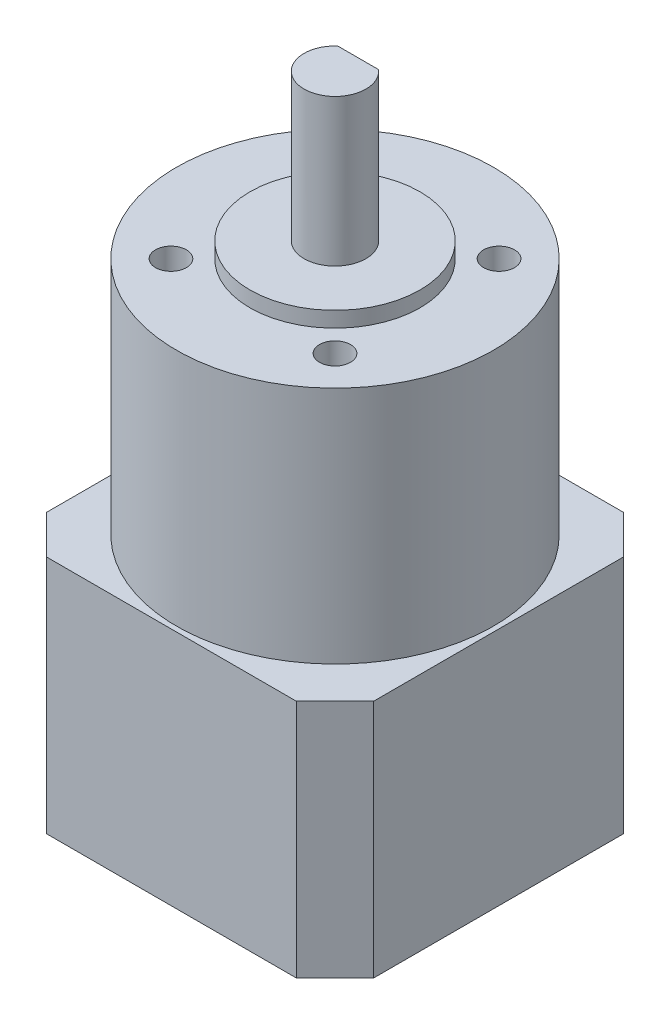
ISO-10303-21;
HEADER;
FILE_DESCRIPTION(('STEP AP214'),'2;1');
FILE_NAME('part.step','',(''),(''),'','','');
FILE_SCHEMA(('AUTOMOTIVE_DESIGN { 1 0 10303 214 1 1 1 1 }'));
ENDSEC;
DATA;
#1=APPLICATION_CONTEXT('core data for automotive mechanical design processes');
#2=APPLICATION_PROTOCOL_DEFINITION('international standard','automotive_design',2000,#1);
#3=PRODUCT_CONTEXT('',#1,'mechanical');
#4=PRODUCT('Part','Part','',(#3));
#5=PRODUCT_RELATED_PRODUCT_CATEGORY('part','',(#4));
#6=PRODUCT_DEFINITION_FORMATION('','',#4);
#7=PRODUCT_DEFINITION_CONTEXT('part definition',#1,'design');
#8=PRODUCT_DEFINITION('design','',#6,#7);
#9=PRODUCT_DEFINITION_SHAPE('','',#8);
#10=(LENGTH_UNIT() NAMED_UNIT(*) SI_UNIT(.MILLI.,.METRE.));
#11=(NAMED_UNIT(*) PLANE_ANGLE_UNIT() SI_UNIT($,.RADIAN.));
#12=(NAMED_UNIT(*) SI_UNIT($,.STERADIAN.) SOLID_ANGLE_UNIT());
#13=UNCERTAINTY_MEASURE_WITH_UNIT(LENGTH_MEASURE(1.E-05),#10,'distance_accuracy_value','');
#14=(GEOMETRIC_REPRESENTATION_CONTEXT(3) GLOBAL_UNCERTAINTY_ASSIGNED_CONTEXT((#13)) GLOBAL_UNIT_ASSIGNED_CONTEXT((#10,
#11,#12)) REPRESENTATION_CONTEXT('',''));
#15=CARTESIAN_POINT('',(0.,0.,0.));
#16=DIRECTION('',(0.,0.,1.));
#17=DIRECTION('',(1.,0.,0.));
#18=AXIS2_PLACEMENT_3D('',#15,#16,#17);
#19=CARTESIAN_POINT('',(-21.15,-30.9,-21.15));
#20=DIRECTION('',(0.,0.,-1.));
#21=DIRECTION('',(-1.,0.,0.));
#22=AXIS2_PLACEMENT_3D('',#19,#20,#21);
#23=PLANE('',#22);
#24=DIRECTION('',(1.,0.,0.));
#25=VECTOR('',#24,1.);
#26=CARTESIAN_POINT('',(-21.15,-61.9,-21.15));
#27=LINE('',#26,#25);
#28=CARTESIAN_POINT('',(-16.15,-61.9,-21.15));
#29=VERTEX_POINT('',#28);
#30=CARTESIAN_POINT('',(16.1500000000001,-61.9,-21.15));
#31=VERTEX_POINT('',#30);
#32=EDGE_CURVE('E156',#29,#31,#27,.T.);
#33=ORIENTED_EDGE('',*,*,#32,.F.);
#34=DIRECTION('',(0.,1.,0.));
#35=VECTOR('',#34,1.);
#36=CARTESIAN_POINT('',(-16.15,-30.9,-21.15));
#37=LINE('',#36,#35);
#38=CARTESIAN_POINT('',(-16.15,-30.9,-21.15));
#39=VERTEX_POINT('',#38);
#40=EDGE_CURVE('E11',#29,#39,#37,.T.);
#41=ORIENTED_EDGE('',*,*,#40,.T.);
#42=DIRECTION('',(1.,0.,0.));
#43=VECTOR('',#42,1.);
#44=CARTESIAN_POINT('',(-21.15,-30.9,-21.15));
#45=LINE('',#44,#43);
#46=CARTESIAN_POINT('',(16.1500000000001,-30.9,-21.15));
#47=VERTEX_POINT('',#46);
#48=EDGE_CURVE('E160',#39,#47,#45,.T.);
#49=ORIENTED_EDGE('',*,*,#48,.T.);
#50=DIRECTION('',(0.,-1.,0.));
#51=VECTOR('',#50,1.);
#52=CARTESIAN_POINT('',(16.1500000000001,-30.9,-21.15));
#53=LINE('',#52,#51);
#54=EDGE_CURVE('E47',#47,#31,#53,.T.);
#55=ORIENTED_EDGE('',*,*,#54,.T.);
#56=EDGE_LOOP('',(#33,#41,#49,#55));
#57=FACE_BOUND('',#56,.T.);
#58=ADVANCED_FACE('F38',(#57),#23,.T.);
#59=CARTESIAN_POINT('',(-21.15,-30.9,21.15));
#60=DIRECTION('',(-1.,0.,0.));
#61=DIRECTION('',(0.,0.,1.));
#62=AXIS2_PLACEMENT_3D('',#59,#60,#61);
#63=PLANE('',#62);
#64=DIRECTION('',(0.,0.,-1.));
#65=VECTOR('',#64,1.);
#66=CARTESIAN_POINT('',(-21.15,-61.9,21.15));
#67=LINE('',#66,#65);
#68=CARTESIAN_POINT('',(-21.15,-61.9,16.15));
#69=VERTEX_POINT('',#68);
#70=CARTESIAN_POINT('',(-21.15,-61.9,-16.1500000000001));
#71=VERTEX_POINT('',#70);
#72=EDGE_CURVE('E164',#69,#71,#67,.T.);
#73=ORIENTED_EDGE('',*,*,#72,.F.);
#74=DIRECTION('',(0.,1.,0.));
#75=VECTOR('',#74,1.);
#76=CARTESIAN_POINT('',(-21.15,-30.9,16.15));
#77=LINE('',#76,#75);
#78=CARTESIAN_POINT('',(-21.15,-30.9,16.15));
#79=VERTEX_POINT('',#78);
#80=EDGE_CURVE('E196',#69,#79,#77,.T.);
#81=ORIENTED_EDGE('',*,*,#80,.T.);
#82=DIRECTION('',(0.,0.,-1.));
#83=VECTOR('',#82,1.);
#84=CARTESIAN_POINT('',(-21.15,-30.9,21.15));
#85=LINE('',#84,#83);
#86=CARTESIAN_POINT('',(-21.15,-30.9,-16.1500000000001));
#87=VERTEX_POINT('',#86);
#88=EDGE_CURVE('E159',#79,#87,#85,.T.);
#89=ORIENTED_EDGE('',*,*,#88,.T.);
#90=DIRECTION('',(0.,-1.,0.));
#91=VECTOR('',#90,1.);
#92=CARTESIAN_POINT('',(-21.15,-30.9,-16.1500000000001));
#93=LINE('',#92,#91);
#94=EDGE_CURVE('E193',#87,#71,#93,.T.);
#95=ORIENTED_EDGE('',*,*,#94,.T.);
#96=EDGE_LOOP('',(#73,#81,#89,#95));
#97=FACE_BOUND('',#96,.T.);
#98=ADVANCED_FACE('F224',(#97),#63,.T.);
#99=CARTESIAN_POINT('',(21.15,-30.9,21.15));
#100=DIRECTION('',(0.,0.,1.));
#101=DIRECTION('',(1.,0.,0.));
#102=AXIS2_PLACEMENT_3D('',#99,#100,#101);
#103=PLANE('',#102);
#104=DIRECTION('',(-1.,0.,0.));
#105=VECTOR('',#104,1.);
#106=CARTESIAN_POINT('',(21.15,-30.9,21.15));
#107=LINE('',#106,#105);
#108=CARTESIAN_POINT('',(16.15,-30.9,21.15));
#109=VERTEX_POINT('',#108);
#110=CARTESIAN_POINT('',(-16.1500000000001,-30.9,21.15));
#111=VERTEX_POINT('',#110);
#112=EDGE_CURVE('E166',#109,#111,#107,.T.);
#113=ORIENTED_EDGE('',*,*,#112,.T.);
#114=DIRECTION('',(0.,-1.,0.));
#115=VECTOR('',#114,1.);
#116=CARTESIAN_POINT('',(-16.1500000000001,-30.9,21.15));
#117=LINE('',#116,#115);
#118=CARTESIAN_POINT('',(-16.1500000000001,-61.9,21.15));
#119=VERTEX_POINT('',#118);
#120=EDGE_CURVE('E182',#111,#119,#117,.T.);
#121=ORIENTED_EDGE('',*,*,#120,.T.);
#122=DIRECTION('',(-1.,0.,0.));
#123=VECTOR('',#122,1.);
#124=CARTESIAN_POINT('',(21.15,-61.9,21.15));
#125=LINE('',#124,#123);
#126=CARTESIAN_POINT('',(16.15,-61.9,21.15));
#127=VERTEX_POINT('',#126);
#128=EDGE_CURVE('E176',#127,#119,#125,.T.);
#129=ORIENTED_EDGE('',*,*,#128,.F.);
#130=DIRECTION('',(0.,1.,0.));
#131=VECTOR('',#130,1.);
#132=CARTESIAN_POINT('',(16.15,-30.9,21.15));
#133=LINE('',#132,#131);
#134=EDGE_CURVE('E146',#127,#109,#133,.T.);
#135=ORIENTED_EDGE('',*,*,#134,.T.);
#136=EDGE_LOOP('',(#113,#121,#129,#135));
#137=FACE_BOUND('',#136,.T.);
#138=ADVANCED_FACE('F234',(#137),#103,.T.);
#139=CARTESIAN_POINT('',(21.15,-30.9,-21.15));
#140=DIRECTION('',(1.,0.,0.));
#141=DIRECTION('',(0.,0.,-1.));
#142=AXIS2_PLACEMENT_3D('',#139,#140,#141);
#143=PLANE('',#142);
#144=DIRECTION('',(0.,0.,1.));
#145=VECTOR('',#144,1.);
#146=CARTESIAN_POINT('',(21.15,-30.9,-21.15));
#147=LINE('',#146,#145);
#148=CARTESIAN_POINT('',(21.15,-30.9,-16.15));
#149=VERTEX_POINT('',#148);
#150=CARTESIAN_POINT('',(21.15,-30.9,16.1500000000001));
#151=VERTEX_POINT('',#150);
#152=EDGE_CURVE('E163',#149,#151,#147,.T.);
#153=ORIENTED_EDGE('',*,*,#152,.T.);
#154=DIRECTION('',(0.,-1.,0.));
#155=VECTOR('',#154,1.);
#156=CARTESIAN_POINT('',(21.15,-30.9,16.1500000000001));
#157=LINE('',#156,#155);
#158=CARTESIAN_POINT('',(21.15,-61.9,16.1500000000001));
#159=VERTEX_POINT('',#158);
#160=EDGE_CURVE('E206',#151,#159,#157,.T.);
#161=ORIENTED_EDGE('',*,*,#160,.T.);
#162=DIRECTION('',(0.,0.,1.));
#163=VECTOR('',#162,1.);
#164=CARTESIAN_POINT('',(21.15,-61.9,-21.15));
#165=LINE('',#164,#163);
#166=CARTESIAN_POINT('',(21.15,-61.9,-16.15));
#167=VERTEX_POINT('',#166);
#168=EDGE_CURVE('E173',#167,#159,#165,.T.);
#169=ORIENTED_EDGE('',*,*,#168,.F.);
#170=DIRECTION('',(0.,1.,0.));
#171=VECTOR('',#170,1.);
#172=CARTESIAN_POINT('',(21.15,-30.9,-16.15));
#173=LINE('',#172,#171);
#174=EDGE_CURVE('E61',#167,#149,#173,.T.);
#175=ORIENTED_EDGE('',*,*,#174,.T.);
#176=EDGE_LOOP('',(#153,#161,#169,#175));
#177=FACE_BOUND('',#176,.T.);
#178=ADVANCED_FACE('F239',(#177),#143,.T.);
#179=CARTESIAN_POINT('',(0.,-30.9,0.));
#180=DIRECTION('',(0.,-1.,0.));
#181=DIRECTION('',(0.,0.,-1.));
#182=AXIS2_PLACEMENT_3D('',#179,#180,#181);
#183=PLANE('',#182);
#184=CARTESIAN_POINT('',(0.,-30.9,0.));
#185=DIRECTION('',(0.,1.,0.));
#186=DIRECTION('',(0.,0.,1.));
#187=AXIS2_PLACEMENT_3D('',#184,#185,#186);
#188=CIRCLE('',#187,20.5);
#189=CARTESIAN_POINT('',(0.,-30.9,-20.5));
#190=VERTEX_POINT('',#189);
#191=EDGE_CURVE('E153',#190,#190,#188,.T.);
#192=ORIENTED_EDGE('',*,*,#191,.F.);
#193=EDGE_LOOP('',(#192));
#194=FACE_BOUND('',#193,.T.);
#195=ORIENTED_EDGE('',*,*,#88,.F.);
#196=DIRECTION('',(-0.707106781186543,0.,-0.707106781186552));
#197=VECTOR('',#196,1.);
#198=CARTESIAN_POINT('',(-16.1500000000001,-30.9,21.15));
#199=LINE('',#198,#197);
#200=EDGE_CURVE('E203',#79,#111,#199,.F.);
#201=ORIENTED_EDGE('',*,*,#200,.T.);
#202=ORIENTED_EDGE('',*,*,#112,.F.);
#203=DIRECTION('',(-0.707106781186551,0.,0.707106781186544));
#204=VECTOR('',#203,1.);
#205=CARTESIAN_POINT('',(21.15,-30.9,16.1500000000001));
#206=LINE('',#205,#204);
#207=EDGE_CURVE('E54',#109,#151,#206,.F.);
#208=ORIENTED_EDGE('',*,*,#207,.T.);
#209=ORIENTED_EDGE('',*,*,#152,.F.);
#210=DIRECTION('',(0.707106781186543,0.,0.707106781186552));
#211=VECTOR('',#210,1.);
#212=CARTESIAN_POINT('',(16.1500000000001,-30.9,-21.15));
#213=LINE('',#212,#211);
#214=EDGE_CURVE('E198',#149,#47,#213,.F.);
#215=ORIENTED_EDGE('',*,*,#214,.T.);
#216=ORIENTED_EDGE('',*,*,#48,.F.);
#217=DIRECTION('',(0.707106781186551,0.,-0.707106781186544));
#218=VECTOR('',#217,1.);
#219=CARTESIAN_POINT('',(-21.15,-30.9,-16.1500000000001));
#220=LINE('',#219,#218);
#221=EDGE_CURVE('E200',#39,#87,#220,.F.);
#222=ORIENTED_EDGE('',*,*,#221,.T.);
#223=EDGE_LOOP('',(#195,#201,#202,#208,#209,#215,#216,#222));
#224=FACE_BOUND('',#223,.T.);
#225=ADVANCED_FACE('F228',(#194,#224),#183,.F.);
#226=CARTESIAN_POINT('',(0.,-61.9,0.));
#227=DIRECTION('',(0.,-1.,0.));
#228=DIRECTION('',(0.,0.,-1.));
#229=AXIS2_PLACEMENT_3D('',#226,#227,#228);
#230=PLANE('',#229);
#231=ORIENTED_EDGE('',*,*,#128,.T.);
#232=DIRECTION('',(0.707106781186543,0.,0.707106781186552));
#233=VECTOR('',#232,1.);
#234=CARTESIAN_POINT('',(-18.6500000000001,-61.9,18.6499999999999));
#235=LINE('',#234,#233);
#236=EDGE_CURVE('E191',#119,#69,#235,.F.);
#237=ORIENTED_EDGE('',*,*,#236,.T.);
#238=ORIENTED_EDGE('',*,*,#72,.T.);
#239=DIRECTION('',(-0.707106781186551,0.,0.707106781186544));
#240=VECTOR('',#239,1.);
#241=CARTESIAN_POINT('',(-18.6499999999999,-61.9,-18.6500000000001));
#242=LINE('',#241,#240);
#243=EDGE_CURVE('E187',#71,#29,#242,.F.);
#244=ORIENTED_EDGE('',*,*,#243,.T.);
#245=ORIENTED_EDGE('',*,*,#32,.T.);
#246=DIRECTION('',(-0.707106781186543,0.,-0.707106781186552));
#247=VECTOR('',#246,1.);
#248=CARTESIAN_POINT('',(18.6500000000001,-61.9,-18.6499999999999));
#249=LINE('',#248,#247);
#250=EDGE_CURVE('E185',#31,#167,#249,.F.);
#251=ORIENTED_EDGE('',*,*,#250,.T.);
#252=ORIENTED_EDGE('',*,*,#168,.T.);
#253=DIRECTION('',(0.707106781186551,0.,-0.707106781186544));
#254=VECTOR('',#253,1.);
#255=CARTESIAN_POINT('',(18.6499999999999,-61.9,18.6500000000001));
#256=LINE('',#255,#254);
#257=EDGE_CURVE('E189',#159,#127,#256,.F.);
#258=ORIENTED_EDGE('',*,*,#257,.T.);
#259=EDGE_LOOP('',(#231,#237,#238,#244,#245,#251,#252,#258));
#260=FACE_BOUND('',#259,.T.);
#261=ADVANCED_FACE('F217',(#260),#230,.T.);
#262=CARTESIAN_POINT('',(0.,0.,0.));
#263=DIRECTION('',(0.,-1.,0.));
#264=DIRECTION('',(0.,0.,-1.));
#265=AXIS2_PLACEMENT_3D('',#262,#263,#264);
#266=CYLINDRICAL_SURFACE('',#265,20.5);
#267=CARTESIAN_POINT('',(0.,0.,0.));
#268=DIRECTION('',(0.,1.,0.));
#269=DIRECTION('',(0.,0.,1.));
#270=AXIS2_PLACEMENT_3D('',#267,#268,#269);
#271=CIRCLE('',#270,20.5);
#272=CARTESIAN_POINT('',(0.,0.,-20.5));
#273=VERTEX_POINT('',#272);
#274=EDGE_CURVE('E150',#273,#273,#271,.T.);
#275=CARTESIAN_POINT('',(0.,0.,-20.5));
#276=CARTESIAN_POINT('',(0.,-0.321875,-20.5));
#277=CARTESIAN_POINT('',(0.,-0.64375,-20.5));
#278=CARTESIAN_POINT('',(0.,-1.2875,-20.5));
#279=CARTESIAN_POINT('',(0.,-1.609375,-20.5));
#280=CARTESIAN_POINT('',(0.,-2.253125,-20.5));
#281=CARTESIAN_POINT('',(0.,-2.575,-20.5));
#282=CARTESIAN_POINT('',(0.,-3.21875,-20.5));
#283=CARTESIAN_POINT('',(0.,-3.540625,-20.5));
#284=CARTESIAN_POINT('',(0.,-4.184375,-20.5));
#285=CARTESIAN_POINT('',(0.,-4.50625,-20.5));
#286=CARTESIAN_POINT('',(0.,-5.15,-20.5));
#287=CARTESIAN_POINT('',(0.,-5.471875,-20.5));
#288=CARTESIAN_POINT('',(0.,-6.115625,-20.5));
#289=CARTESIAN_POINT('',(0.,-6.4375,-20.5));
#290=CARTESIAN_POINT('',(0.,-7.08125,-20.5));
#291=CARTESIAN_POINT('',(0.,-7.403125,-20.5));
#292=CARTESIAN_POINT('',(0.,-8.046875,-20.5));
#293=CARTESIAN_POINT('',(0.,-8.36875,-20.5));
#294=CARTESIAN_POINT('',(0.,-9.0125,-20.5));
#295=CARTESIAN_POINT('',(0.,-9.334375,-20.5));
#296=CARTESIAN_POINT('',(0.,-9.978125,-20.5));
#297=CARTESIAN_POINT('',(0.,-10.3,-20.5));
#298=CARTESIAN_POINT('',(0.,-10.94375,-20.5));
#299=CARTESIAN_POINT('',(0.,-11.265625,-20.5));
#300=CARTESIAN_POINT('',(0.,-11.909375,-20.5));
#301=CARTESIAN_POINT('',(0.,-12.23125,-20.5));
#302=CARTESIAN_POINT('',(0.,-12.875,-20.5));
#303=CARTESIAN_POINT('',(0.,-13.196875,-20.5));
#304=CARTESIAN_POINT('',(0.,-13.840625,-20.5));
#305=CARTESIAN_POINT('',(0.,-14.1625,-20.5));
#306=CARTESIAN_POINT('',(0.,-14.80625,-20.5));
#307=CARTESIAN_POINT('',(0.,-15.128125,-20.5));
#308=CARTESIAN_POINT('',(0.,-15.771875,-20.5));
#309=CARTESIAN_POINT('',(0.,-16.09375,-20.5));
#310=CARTESIAN_POINT('',(0.,-16.7375,-20.5));
#311=CARTESIAN_POINT('',(0.,-17.059375,-20.5));
#312=CARTESIAN_POINT('',(0.,-17.703125,-20.5));
#313=CARTESIAN_POINT('',(0.,-18.025,-20.5));
#314=CARTESIAN_POINT('',(0.,-18.66875,-20.5));
#315=CARTESIAN_POINT('',(0.,-18.990625,-20.5));
#316=CARTESIAN_POINT('',(0.,-19.634375,-20.5));
#317=CARTESIAN_POINT('',(0.,-19.95625,-20.5));
#318=CARTESIAN_POINT('',(0.,-20.6,-20.5));
#319=CARTESIAN_POINT('',(0.,-20.921875,-20.5));
#320=CARTESIAN_POINT('',(0.,-21.565625,-20.5));
#321=CARTESIAN_POINT('',(0.,-21.8875,-20.5));
#322=CARTESIAN_POINT('',(0.,-22.53125,-20.5));
#323=CARTESIAN_POINT('',(0.,-22.853125,-20.5));
#324=CARTESIAN_POINT('',(0.,-23.496875,-20.5));
#325=CARTESIAN_POINT('',(0.,-23.81875,-20.5));
#326=CARTESIAN_POINT('',(0.,-24.4625,-20.5));
#327=CARTESIAN_POINT('',(0.,-24.784375,-20.5));
#328=CARTESIAN_POINT('',(0.,-25.428125,-20.5));
#329=CARTESIAN_POINT('',(0.,-25.75,-20.5));
#330=CARTESIAN_POINT('',(0.,-26.39375,-20.5));
#331=CARTESIAN_POINT('',(0.,-26.715625,-20.5));
#332=CARTESIAN_POINT('',(0.,-27.359375,-20.5));
#333=CARTESIAN_POINT('',(0.,-27.68125,-20.5));
#334=CARTESIAN_POINT('',(0.,-28.325,-20.5));
#335=CARTESIAN_POINT('',(0.,-28.646875,-20.5));
#336=CARTESIAN_POINT('',(0.,-29.290625,-20.5));
#337=CARTESIAN_POINT('',(0.,-29.6125,-20.5));
#338=CARTESIAN_POINT('',(0.,-30.25625,-20.5));
#339=CARTESIAN_POINT('',(0.,-30.578125,-20.5));
#340=CARTESIAN_POINT('',(0.,-30.9,-20.5));
#341=B_SPLINE_CURVE_WITH_KNOTS('',3,(#275,#276,#277,#278,#279,#280,#281,#282,#283,#284,#285,
#286,#287,#288,#289,#290,#291,#292,#293,#294,#295,#296,#297,#298,#299,#300,#301,#302,#303,#304,
#305,#306,#307,#308,#309,#310,#311,#312,#313,#314,#315,#316,#317,#318,#319,#320,#321,#322,#323,
#324,#325,#326,#327,#328,#329,#330,#331,#332,#333,#334,#335,#336,#337,#338,#339,#340),
.UNSPECIFIED.,.F.,.F.,(4,2,2,2,2,2,2,2,2,2,2,2,2,2,2,2,2,2,2,2,2,2,2,2,2,2,2,2,2,2,2,2,4),(0.,
0.965625,1.93125,2.896875,3.8625,4.828125,5.79375,6.759375,7.725,8.690625,9.65625,10.621875,
11.5875,12.553125,13.51875,14.484375,15.45,16.415625,17.38125,18.346875,19.3125,20.278125,
21.24375,22.209375,23.175,24.140625,25.10625,26.071875,27.0375,28.003125,28.96875,29.934375,
30.9),.UNSPECIFIED.);
#342=EDGE_CURVE('BSEAM418',#273,#190,#341,.T.);
#343=ORIENTED_EDGE('',*,*,#274,.F.);
#344=ORIENTED_EDGE('',*,*,#191,.T.);
#345=ORIENTED_EDGE('',*,*,#342,.T.);
#346=ORIENTED_EDGE('',*,*,#342,.F.);
#347=EDGE_LOOP('',(#343,#345,#344,#346));
#348=FACE_BOUND('',#347,.T.);
#349=ADVANCED_FACE('F418',(#348),#266,.T.);
#350=CARTESIAN_POINT('',(0.,0.,0.));
#351=DIRECTION('',(0.,1.,0.));
#352=DIRECTION('',(0.,0.,1.));
#353=AXIS2_PLACEMENT_3D('',#350,#351,#352);
#354=PLANE('',#353);
#355=CARTESIAN_POINT('',(-10.6066017177976,0.,10.6066017177982));
#356=DIRECTION('',(0.,1.,0.));
#357=DIRECTION('',(0.,0.,1.));
#358=AXIS2_PLACEMENT_3D('',#355,#356,#357);
#359=CIRCLE('',#358,1.99999999999999);
#360=CARTESIAN_POINT('',(-10.6066017177976,0.,12.6066017177982));
#361=VERTEX_POINT('',#360);
#362=EDGE_CURVE('E491',#361,#361,#359,.T.);
#363=ORIENTED_EDGE('',*,*,#362,.F.);
#364=EDGE_LOOP('',(#363));
#365=FACE_BOUND('',#364,.T.);
#366=CARTESIAN_POINT('',(10.6066017177988,0.,10.6066017177976));
#367=DIRECTION('',(0.,1.,0.));
#368=DIRECTION('',(0.,0.,1.));
#369=AXIS2_PLACEMENT_3D('',#366,#367,#368);
#370=CIRCLE('',#369,1.99999999999999);
#371=CARTESIAN_POINT('',(10.6066017177988,0.,12.6066017177976));
#372=VERTEX_POINT('',#371);
#373=EDGE_CURVE('E495',#372,#372,#370,.T.);
#374=ORIENTED_EDGE('',*,*,#373,.F.);
#375=EDGE_LOOP('',(#374));
#376=FACE_BOUND('',#375,.T.);
#377=CARTESIAN_POINT('',(10.6066017177982,0.,-10.6066017177988));
#378=DIRECTION('',(0.,1.,0.));
#379=DIRECTION('',(0.,0.,1.));
#380=AXIS2_PLACEMENT_3D('',#377,#378,#379);
#381=CIRCLE('',#380,1.99999999999999);
#382=CARTESIAN_POINT('',(10.6066017177982,0.,-8.60660171779882));
#383=VERTEX_POINT('',#382);
#384=EDGE_CURVE('E499',#383,#383,#381,.T.);
#385=ORIENTED_EDGE('',*,*,#384,.F.);
#386=EDGE_LOOP('',(#385));
#387=FACE_BOUND('',#386,.T.);
#388=CARTESIAN_POINT('',(-10.6066017177982,0.,-10.6066017177982));
#389=DIRECTION('',(0.,1.,0.));
#390=DIRECTION('',(0.,0.,1.));
#391=AXIS2_PLACEMENT_3D('',#388,#389,#390);
#392=CIRCLE('',#391,1.99999999999999);
#393=CARTESIAN_POINT('',(-10.6066017177982,0.,-8.60660171779822));
#394=VERTEX_POINT('',#393);
#395=EDGE_CURVE('E503',#394,#394,#392,.T.);
#396=ORIENTED_EDGE('',*,*,#395,.F.);
#397=EDGE_LOOP('',(#396));
#398=FACE_BOUND('',#397,.T.);
#399=CARTESIAN_POINT('',(0.,0.,0.));
#400=DIRECTION('',(0.,1.,0.));
#401=DIRECTION('',(0.,0.,1.));
#402=AXIS2_PLACEMENT_3D('',#399,#400,#401);
#403=CIRCLE('',#402,11.);
#404=CARTESIAN_POINT('',(0.,0.,11.));
#405=VERTEX_POINT('',#404);
#406=EDGE_CURVE('E147',#405,#405,#403,.T.);
#407=ORIENTED_EDGE('',*,*,#406,.F.);
#408=EDGE_LOOP('',(#407));
#409=FACE_BOUND('',#408,.T.);
#410=ORIENTED_EDGE('',*,*,#274,.T.);
#411=EDGE_LOOP('',(#410));
#412=FACE_BOUND('',#411,.T.);
#413=ADVANCED_FACE('F409',(#365,#376,#387,#398,#409,#412),#354,.T.);
#414=CARTESIAN_POINT('',(0.,2.,0.));
#415=DIRECTION('',(0.,-1.,0.));
#416=DIRECTION('',(0.,0.,-1.));
#417=AXIS2_PLACEMENT_3D('',#414,#415,#416);
#418=CYLINDRICAL_SURFACE('',#417,11.);
#419=CARTESIAN_POINT('',(0.,2.,0.));
#420=DIRECTION('',(0.,1.,0.));
#421=DIRECTION('',(0.,0.,1.));
#422=AXIS2_PLACEMENT_3D('',#419,#420,#421);
#423=CIRCLE('',#422,11.);
#424=CARTESIAN_POINT('',(0.,2.,11.));
#425=VERTEX_POINT('',#424);
#426=EDGE_CURVE('E142',#425,#425,#423,.T.);
#427=ORIENTED_EDGE('',*,*,#426,.F.);
#428=EDGE_LOOP('',(#427));
#429=FACE_BOUND('',#428,.T.);
#430=ORIENTED_EDGE('',*,*,#406,.T.);
#431=EDGE_LOOP('',(#430));
#432=FACE_BOUND('',#431,.T.);
#433=ADVANCED_FACE('F400',(#429,#432),#418,.T.);
#434=CARTESIAN_POINT('',(0.,2.,0.));
#435=DIRECTION('',(0.,1.,0.));
#436=DIRECTION('',(0.,0.,1.));
#437=AXIS2_PLACEMENT_3D('',#434,#435,#436);
#438=PLANE('',#437);
#439=CARTESIAN_POINT('',(0.,2.,0.));
#440=DIRECTION('',(0.,1.,0.));
#441=DIRECTION('',(0.,0.,1.));
#442=AXIS2_PLACEMENT_3D('',#439,#440,#441);
#443=CIRCLE('',#442,4.);
#444=CARTESIAN_POINT('',(0.,2.,4.));
#445=VERTEX_POINT('',#444);
#446=EDGE_CURVE('E143',#445,#445,#443,.T.);
#447=ORIENTED_EDGE('',*,*,#446,.F.);
#448=EDGE_LOOP('',(#447));
#449=FACE_BOUND('',#448,.T.);
#450=ORIENTED_EDGE('',*,*,#426,.T.);
#451=EDGE_LOOP('',(#450));
#452=FACE_BOUND('',#451,.T.);
#453=ADVANCED_FACE('F392',(#449,#452),#438,.T.);
#454=CARTESIAN_POINT('',(0.,21.,0.));
#455=DIRECTION('',(0.,-1.,0.));
#456=DIRECTION('',(0.,0.,-1.));
#457=AXIS2_PLACEMENT_3D('',#454,#455,#456);
#458=CYLINDRICAL_SURFACE('',#457,4.);
#459=CARTESIAN_POINT('',(0.,21.,0.));
#460=DIRECTION('',(0.,1.,0.));
#461=DIRECTION('',(0.,0.,1.));
#462=AXIS2_PLACEMENT_3D('',#459,#460,#461);
#463=CIRCLE('',#462,4.);
#464=CARTESIAN_POINT('',(-2.64575131106459,21.,-3.));
#465=VERTEX_POINT('',#464);
#466=CARTESIAN_POINT('',(2.64575131106459,21.,-3.));
#467=VERTEX_POINT('',#466);
#468=EDGE_CURVE('E136',#465,#467,#463,.T.);
#469=ORIENTED_EDGE('',*,*,#468,.F.);
#470=DIRECTION('',(0.,1.,0.));
#471=VECTOR('',#470,1.);
#472=CARTESIAN_POINT('',(-2.64575131106459,8.,-3.));
#473=LINE('',#472,#471);
#474=CARTESIAN_POINT('',(-2.64575131106459,8.,-3.));
#475=VERTEX_POINT('',#474);
#476=EDGE_CURVE('E128',#475,#465,#473,.T.);
#477=ORIENTED_EDGE('',*,*,#476,.F.);
#478=CARTESIAN_POINT('',(0.,8.,0.));
#479=DIRECTION('',(0.,1.,0.));
#480=DIRECTION('',(0.,0.,1.));
#481=AXIS2_PLACEMENT_3D('',#478,#479,#480);
#482=CIRCLE('',#481,4.);
#483=CARTESIAN_POINT('',(2.64575131106459,8.,-3.));
#484=VERTEX_POINT('',#483);
#485=EDGE_CURVE('E117',#484,#475,#482,.T.);
#486=ORIENTED_EDGE('',*,*,#485,.F.);
#487=DIRECTION('',(0.,1.,0.));
#488=VECTOR('',#487,1.);
#489=CARTESIAN_POINT('',(2.64575131106459,8.,-3.));
#490=LINE('',#489,#488);
#491=EDGE_CURVE('E130',#484,#467,#490,.T.);
#492=ORIENTED_EDGE('',*,*,#491,.T.);
#493=EDGE_LOOP('',(#469,#477,#486,#492));
#494=FACE_BOUND('',#493,.T.);
#495=ORIENTED_EDGE('',*,*,#446,.T.);
#496=EDGE_LOOP('',(#495));
#497=FACE_BOUND('',#496,.T.);
#498=ADVANCED_FACE('F133',(#494,#497),#458,.T.);
#499=CARTESIAN_POINT('',(0.,21.,0.));
#500=DIRECTION('',(0.,1.,0.));
#501=DIRECTION('',(0.,0.,1.));
#502=AXIS2_PLACEMENT_3D('',#499,#500,#501);
#503=PLANE('',#502);
#504=DIRECTION('',(1.,0.,0.));
#505=VECTOR('',#504,1.);
#506=CARTESIAN_POINT('',(-2.64575131106459,21.,-3.));
#507=LINE('',#506,#505);
#508=EDGE_CURVE('E124',#465,#467,#507,.T.);
#509=ORIENTED_EDGE('',*,*,#508,.F.);
#510=ORIENTED_EDGE('',*,*,#468,.T.);
#511=EDGE_LOOP('',(#509,#510));
#512=FACE_BOUND('',#511,.T.);
#513=ADVANCED_FACE('F376',(#512),#503,.T.);
#514=CARTESIAN_POINT('',(-2.64575131106459,8.,-3.));
#515=DIRECTION('',(0.,0.,1.));
#516=DIRECTION('',(1.,0.,0.));
#517=AXIS2_PLACEMENT_3D('',#514,#515,#516);
#518=PLANE('',#517);
#519=ORIENTED_EDGE('',*,*,#508,.T.);
#520=ORIENTED_EDGE('',*,*,#491,.F.);
#521=DIRECTION('',(1.,0.,0.));
#522=VECTOR('',#521,1.);
#523=CARTESIAN_POINT('',(-2.64575131106459,8.,-3.));
#524=LINE('',#523,#522);
#525=EDGE_CURVE('E120',#475,#484,#524,.T.);
#526=ORIENTED_EDGE('',*,*,#525,.F.);
#527=ORIENTED_EDGE('',*,*,#476,.T.);
#528=EDGE_LOOP('',(#519,#520,#526,#527));
#529=FACE_BOUND('',#528,.T.);
#530=ADVANCED_FACE('F127',(#529),#518,.F.);
#531=CARTESIAN_POINT('',(0.,8.,0.));
#532=DIRECTION('',(0.,1.,0.));
#533=DIRECTION('',(0.,0.,1.));
#534=AXIS2_PLACEMENT_3D('',#531,#532,#533);
#535=PLANE('',#534);
#536=ORIENTED_EDGE('',*,*,#485,.T.);
#537=ORIENTED_EDGE('',*,*,#525,.T.);
#538=EDGE_LOOP('',(#536,#537));
#539=FACE_BOUND('',#538,.T.);
#540=ADVANCED_FACE('F119',(#539),#535,.T.);
#541=CARTESIAN_POINT('',(-10.6066017177982,-5.,-10.6066017177982));
#542=DIRECTION('',(0.,-1.,0.));
#543=DIRECTION('',(0.,0.,-1.));
#544=AXIS2_PLACEMENT_3D('',#541,#542,#543);
#545=PLANE('',#544);
#546=CARTESIAN_POINT('',(-10.6066017177982,-5.,-10.6066017177982));
#547=DIRECTION('',(0.,1.,0.));
#548=DIRECTION('',(0.,0.,1.));
#549=AXIS2_PLACEMENT_3D('',#546,#547,#548);
#550=CIRCLE('',#549,1.99999999999999);
#551=CARTESIAN_POINT('',(-10.6066017177982,-5.,-8.60660171779823));
#552=VERTEX_POINT('',#551);
#553=EDGE_CURVE('E507',#552,#552,#550,.T.);
#554=ORIENTED_EDGE('',*,*,#553,.T.);
#555=EDGE_LOOP('',(#554));
#556=FACE_BOUND('',#555,.T.);
#557=ADVANCED_FACE('F351',(#556),#545,.F.);
#558=CARTESIAN_POINT('',(-10.6066017177982,0.,-10.6066017177982));
#559=DIRECTION('',(0.,1.,0.));
#560=DIRECTION('',(0.,0.,1.));
#561=AXIS2_PLACEMENT_3D('',#558,#559,#560);
#562=CYLINDRICAL_SURFACE('',#561,1.99999999999999);
#563=ORIENTED_EDGE('',*,*,#553,.F.);
#564=EDGE_LOOP('',(#563));
#565=FACE_BOUND('',#564,.T.);
#566=ORIENTED_EDGE('',*,*,#395,.T.);
#567=EDGE_LOOP('',(#566));
#568=FACE_BOUND('',#567,.T.);
#569=ADVANCED_FACE('F342',(#565,#568),#562,.F.);
#570=CARTESIAN_POINT('',(10.6066017177982,-5.,-10.6066017177988));
#571=DIRECTION('',(0.,-1.,0.));
#572=DIRECTION('',(0.,0.,-1.));
#573=AXIS2_PLACEMENT_3D('',#570,#571,#572);
#574=PLANE('',#573);
#575=CARTESIAN_POINT('',(10.6066017177982,-5.,-10.6066017177988));
#576=DIRECTION('',(0.,1.,0.));
#577=DIRECTION('',(0.,0.,1.));
#578=AXIS2_PLACEMENT_3D('',#575,#576,#577);
#579=CIRCLE('',#578,1.99999999999999);
#580=CARTESIAN_POINT('',(10.6066017177982,-5.,-8.60660171779882));
#581=VERTEX_POINT('',#580);
#582=EDGE_CURVE('E508',#581,#581,#579,.T.);
#583=ORIENTED_EDGE('',*,*,#582,.T.);
#584=EDGE_LOOP('',(#583));
#585=FACE_BOUND('',#584,.T.);
#586=ADVANCED_FACE('F333',(#585),#574,.F.);
#587=CARTESIAN_POINT('',(10.6066017177982,0.,-10.6066017177988));
#588=DIRECTION('',(0.,1.,0.));
#589=DIRECTION('',(0.,0.,1.));
#590=AXIS2_PLACEMENT_3D('',#587,#588,#589);
#591=CYLINDRICAL_SURFACE('',#590,1.99999999999999);
#592=ORIENTED_EDGE('',*,*,#582,.F.);
#593=EDGE_LOOP('',(#592));
#594=FACE_BOUND('',#593,.T.);
#595=ORIENTED_EDGE('',*,*,#384,.T.);
#596=EDGE_LOOP('',(#595));
#597=FACE_BOUND('',#596,.T.);
#598=ADVANCED_FACE('F324',(#594,#597),#591,.F.);
#599=CARTESIAN_POINT('',(10.6066017177988,-5.,10.6066017177976));
#600=DIRECTION('',(0.,-1.,0.));
#601=DIRECTION('',(0.,0.,-1.));
#602=AXIS2_PLACEMENT_3D('',#599,#600,#601);
#603=PLANE('',#602);
#604=CARTESIAN_POINT('',(10.6066017177988,-5.,10.6066017177976));
#605=DIRECTION('',(0.,1.,0.));
#606=DIRECTION('',(0.,0.,1.));
#607=AXIS2_PLACEMENT_3D('',#604,#605,#606);
#608=CIRCLE('',#607,1.99999999999999);
#609=CARTESIAN_POINT('',(10.6066017177988,-5.,12.6066017177976));
#610=VERTEX_POINT('',#609);
#611=EDGE_CURVE('E516',#610,#610,#608,.T.);
#612=ORIENTED_EDGE('',*,*,#611,.T.);
#613=EDGE_LOOP('',(#612));
#614=FACE_BOUND('',#613,.T.);
#615=ADVANCED_FACE('F315',(#614),#603,.F.);
#616=CARTESIAN_POINT('',(10.6066017177988,0.,10.6066017177976));
#617=DIRECTION('',(0.,1.,0.));
#618=DIRECTION('',(0.,0.,1.));
#619=AXIS2_PLACEMENT_3D('',#616,#617,#618);
#620=CYLINDRICAL_SURFACE('',#619,1.99999999999999);
#621=ORIENTED_EDGE('',*,*,#611,.F.);
#622=EDGE_LOOP('',(#621));
#623=FACE_BOUND('',#622,.T.);
#624=ORIENTED_EDGE('',*,*,#373,.T.);
#625=EDGE_LOOP('',(#624));
#626=FACE_BOUND('',#625,.T.);
#627=ADVANCED_FACE('F306',(#623,#626),#620,.F.);
#628=CARTESIAN_POINT('',(-10.6066017177976,-5.,10.6066017177982));
#629=DIRECTION('',(0.,-1.,0.));
#630=DIRECTION('',(0.,0.,-1.));
#631=AXIS2_PLACEMENT_3D('',#628,#629,#630);
#632=PLANE('',#631);
#633=CARTESIAN_POINT('',(-10.6066017177976,-5.,10.6066017177982));
#634=DIRECTION('',(0.,1.,0.));
#635=DIRECTION('',(0.,0.,1.));
#636=AXIS2_PLACEMENT_3D('',#633,#634,#635);
#637=CIRCLE('',#636,1.99999999999999);
#638=CARTESIAN_POINT('',(-10.6066017177976,-5.,12.6066017177982));
#639=VERTEX_POINT('',#638);
#640=EDGE_CURVE('E520',#639,#639,#637,.T.);
#641=ORIENTED_EDGE('',*,*,#640,.T.);
#642=EDGE_LOOP('',(#641));
#643=FACE_BOUND('',#642,.T.);
#644=ADVANCED_FACE('F297',(#643),#632,.F.);
#645=CARTESIAN_POINT('',(-10.6066017177976,0.,10.6066017177982));
#646=DIRECTION('',(0.,1.,0.));
#647=DIRECTION('',(0.,0.,1.));
#648=AXIS2_PLACEMENT_3D('',#645,#646,#647);
#649=CYLINDRICAL_SURFACE('',#648,1.99999999999999);
#650=ORIENTED_EDGE('',*,*,#640,.F.);
#651=EDGE_LOOP('',(#650));
#652=FACE_BOUND('',#651,.T.);
#653=ORIENTED_EDGE('',*,*,#362,.T.);
#654=EDGE_LOOP('',(#653));
#655=FACE_BOUND('',#654,.T.);
#656=ADVANCED_FACE('F259',(#652,#655),#649,.F.);
#657=CARTESIAN_POINT('',(-16.1500000000001,-30.9,21.15));
#658=DIRECTION('',(0.707106781186552,0.,-0.707106781186543));
#659=DIRECTION('',(0.,-1.,0.));
#660=AXIS2_PLACEMENT_3D('',#657,#658,#659);
#661=PLANE('',#660);
#662=ORIENTED_EDGE('',*,*,#200,.F.);
#663=ORIENTED_EDGE('',*,*,#80,.F.);
#664=ORIENTED_EDGE('',*,*,#236,.F.);
#665=ORIENTED_EDGE('',*,*,#120,.F.);
#666=EDGE_LOOP('',(#662,#663,#664,#665));
#667=FACE_BOUND('',#666,.T.);
#668=ADVANCED_FACE('F231',(#667),#661,.F.);
#669=CARTESIAN_POINT('',(21.15,-30.9,16.1500000000001));
#670=DIRECTION('',(-0.707106781186544,0.,-0.707106781186551));
#671=DIRECTION('',(0.,-1.,0.));
#672=AXIS2_PLACEMENT_3D('',#669,#670,#671);
#673=PLANE('',#672);
#674=ORIENTED_EDGE('',*,*,#207,.F.);
#675=ORIENTED_EDGE('',*,*,#134,.F.);
#676=ORIENTED_EDGE('',*,*,#257,.F.);
#677=ORIENTED_EDGE('',*,*,#160,.F.);
#678=EDGE_LOOP('',(#674,#675,#676,#677));
#679=FACE_BOUND('',#678,.T.);
#680=ADVANCED_FACE('F238',(#679),#673,.F.);
#681=CARTESIAN_POINT('',(-21.15,-30.9,-16.1500000000001));
#682=DIRECTION('',(0.707106781186544,0.,0.707106781186551));
#683=DIRECTION('',(0.,-1.,0.));
#684=AXIS2_PLACEMENT_3D('',#681,#682,#683);
#685=PLANE('',#684);
#686=ORIENTED_EDGE('',*,*,#221,.F.);
#687=ORIENTED_EDGE('',*,*,#40,.F.);
#688=ORIENTED_EDGE('',*,*,#243,.F.);
#689=ORIENTED_EDGE('',*,*,#94,.F.);
#690=EDGE_LOOP('',(#686,#687,#688,#689));
#691=FACE_BOUND('',#690,.T.);
#692=ADVANCED_FACE('F222',(#691),#685,.F.);
#693=CARTESIAN_POINT('',(16.1500000000001,-30.9,-21.15));
#694=DIRECTION('',(-0.707106781186552,0.,0.707106781186543));
#695=DIRECTION('',(0.,-1.,0.));
#696=AXIS2_PLACEMENT_3D('',#693,#694,#695);
#697=PLANE('',#696);
#698=ORIENTED_EDGE('',*,*,#214,.F.);
#699=ORIENTED_EDGE('',*,*,#174,.F.);
#700=ORIENTED_EDGE('',*,*,#250,.F.);
#701=ORIENTED_EDGE('',*,*,#54,.F.);
#702=EDGE_LOOP('',(#698,#699,#700,#701));
#703=FACE_BOUND('',#702,.T.);
#704=ADVANCED_FACE('F41',(#703),#697,.F.);
#705=CLOSED_SHELL('',(#58,#98,#138,#178,#225,#261,#349,#413,#433,#453,#498,#513,#530,#540,#557,
#569,#586,#598,#615,#627,#644,#656,#668,#680,#692,#704));
#706=MANIFOLD_SOLID_BREP('B2',#705);
#707=ADVANCED_BREP_SHAPE_REPRESENTATION('',(#18,#706),#14);
#708=SHAPE_DEFINITION_REPRESENTATION(#9,#707);
ENDSEC;
END-ISO-10303-21;
